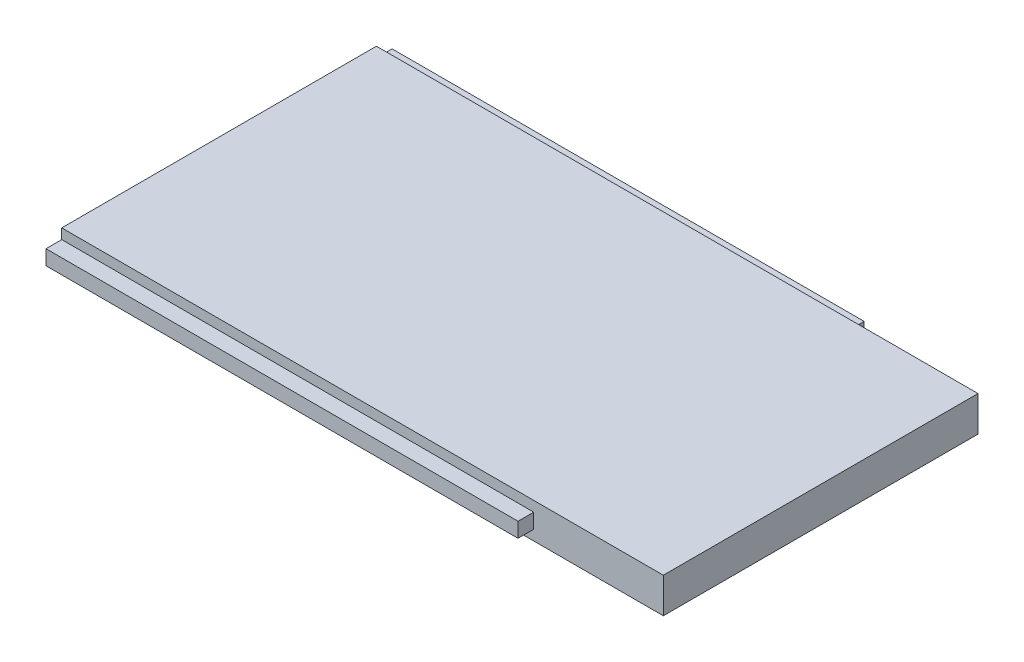
ISO-10303-21;
HEADER;
FILE_DESCRIPTION(('STEP AP214'),'2;1');
FILE_NAME('part.step','',(''),(''),'','','');
FILE_SCHEMA(('AUTOMOTIVE_DESIGN { 1 0 10303 214 1 1 1 1 }'));
ENDSEC;
DATA;
#1=APPLICATION_CONTEXT('core data for automotive mechanical design processes');
#2=APPLICATION_PROTOCOL_DEFINITION('international standard','automotive_design',2000,#1);
#3=PRODUCT_CONTEXT('',#1,'mechanical');
#4=PRODUCT('Part','Part','',(#3));
#5=PRODUCT_RELATED_PRODUCT_CATEGORY('part','',(#4));
#6=PRODUCT_DEFINITION_FORMATION('','',#4);
#7=PRODUCT_DEFINITION_CONTEXT('part definition',#1,'design');
#8=PRODUCT_DEFINITION('design','',#6,#7);
#9=PRODUCT_DEFINITION_SHAPE('','',#8);
#10=(LENGTH_UNIT() NAMED_UNIT(*) SI_UNIT(.MILLI.,.METRE.));
#11=(NAMED_UNIT(*) PLANE_ANGLE_UNIT() SI_UNIT($,.RADIAN.));
#12=(NAMED_UNIT(*) SI_UNIT($,.STERADIAN.) SOLID_ANGLE_UNIT());
#13=UNCERTAINTY_MEASURE_WITH_UNIT(LENGTH_MEASURE(1.E-05),#10,'distance_accuracy_value','');
#14=(GEOMETRIC_REPRESENTATION_CONTEXT(3) GLOBAL_UNCERTAINTY_ASSIGNED_CONTEXT((#13)) GLOBAL_UNIT_ASSIGNED_CONTEXT((#10,
#11,#12)) REPRESENTATION_CONTEXT('',''));
#15=CARTESIAN_POINT('',(0.,0.,0.));
#16=DIRECTION('',(0.,0.,1.));
#17=DIRECTION('',(1.,0.,0.));
#18=AXIS2_PLACEMENT_3D('',#15,#16,#17);
#19=CARTESIAN_POINT('',(0.,3.8,-34.));
#20=DIRECTION('',(0.,0.,-1.));
#21=DIRECTION('',(-1.,0.,0.));
#22=AXIS2_PLACEMENT_3D('',#19,#20,#21);
#23=PLANE('',#22);
#24=DIRECTION('',(1.,0.,0.));
#25=VECTOR('',#24,1.);
#26=CARTESIAN_POINT('',(51.,2.7,-34.));
#27=LINE('',#26,#25);
#28=CARTESIAN_POINT('',(0.,2.7,-34.));
#29=VERTEX_POINT('',#28);
#30=CARTESIAN_POINT('',(51.,2.7,-34.));
#31=VERTEX_POINT('',#30);
#32=EDGE_CURVE('E164',#29,#31,#27,.T.);
#33=ORIENTED_EDGE('',*,*,#32,.F.);
#34=DIRECTION('',(0.,-1.,0.));
#35=VECTOR('',#34,1.);
#36=CARTESIAN_POINT('',(0.,3.8,-34.));
#37=LINE('',#36,#35);
#38=CARTESIAN_POINT('',(0.,3.8,-34.));
#39=VERTEX_POINT('',#38);
#40=EDGE_CURVE('E11',#39,#29,#37,.T.);
#41=ORIENTED_EDGE('',*,*,#40,.F.);
#42=DIRECTION('',(1.,0.,0.));
#43=VECTOR('',#42,1.);
#44=CARTESIAN_POINT('',(0.,3.8,-34.));
#45=LINE('',#44,#43);
#46=CARTESIAN_POINT('',(65.,3.8,-34.));
#47=VERTEX_POINT('',#46);
#48=EDGE_CURVE('E188',#39,#47,#45,.T.);
#49=ORIENTED_EDGE('',*,*,#48,.T.);
#50=DIRECTION('',(0.,-1.,0.));
#51=VECTOR('',#50,1.);
#52=CARTESIAN_POINT('',(65.,3.8,-34.));
#53=LINE('',#52,#51);
#54=CARTESIAN_POINT('',(65.,0.,-34.));
#55=VERTEX_POINT('',#54);
#56=EDGE_CURVE('E38',#47,#55,#53,.T.);
#57=ORIENTED_EDGE('',*,*,#56,.T.);
#58=DIRECTION('',(1.,0.,0.));
#59=VECTOR('',#58,1.);
#60=CARTESIAN_POINT('',(0.,0.,-34.));
#61=LINE('',#60,#59);
#62=CARTESIAN_POINT('',(0.,0.,-34.));
#63=VERTEX_POINT('',#62);
#64=EDGE_CURVE('E187',#63,#55,#61,.T.);
#65=ORIENTED_EDGE('',*,*,#64,.F.);
#66=CARTESIAN_POINT('',(0.,1.1,-34.));
#67=VERTEX_POINT('',#66);
#68=EDGE_CURVE('E43',#67,#63,#37,.T.);
#69=ORIENTED_EDGE('',*,*,#68,.F.);
#70=DIRECTION('',(-1.,0.,0.));
#71=VECTOR('',#70,1.);
#72=CARTESIAN_POINT('',(51.,1.1,-34.));
#73=LINE('',#72,#71);
#74=CARTESIAN_POINT('',(51.,1.1,-34.));
#75=VERTEX_POINT('',#74);
#76=EDGE_CURVE('E172',#75,#67,#73,.T.);
#77=ORIENTED_EDGE('',*,*,#76,.F.);
#78=DIRECTION('',(0.,-1.,0.));
#79=VECTOR('',#78,1.);
#80=CARTESIAN_POINT('',(51.,2.7,-34.));
#81=LINE('',#80,#79);
#82=EDGE_CURVE('E59',#31,#75,#81,.T.);
#83=ORIENTED_EDGE('',*,*,#82,.F.);
#84=EDGE_LOOP('',(#33,#41,#49,#57,#65,#69,#77,#83));
#85=FACE_BOUND('',#84,.T.);
#86=ADVANCED_FACE('F35',(#85),#23,.T.);
#87=CARTESIAN_POINT('',(0.,3.8,0.));
#88=DIRECTION('',(-1.,0.,0.));
#89=DIRECTION('',(0.,0.,1.));
#90=AXIS2_PLACEMENT_3D('',#87,#88,#89);
#91=PLANE('',#90);
#92=DIRECTION('',(0.,0.,-1.));
#93=VECTOR('',#92,1.);
#94=CARTESIAN_POINT('',(0.,0.,0.));
#95=LINE('',#94,#93);
#96=CARTESIAN_POINT('',(0.,0.,0.));
#97=VERTEX_POINT('',#96);
#98=EDGE_CURVE('E192',#97,#63,#95,.T.);
#99=ORIENTED_EDGE('',*,*,#98,.F.);
#100=DIRECTION('',(0.,-1.,0.));
#101=VECTOR('',#100,1.);
#102=CARTESIAN_POINT('',(0.,3.8,0.));
#103=LINE('',#102,#101);
#104=CARTESIAN_POINT('',(0.,1.1,0.));
#105=VERTEX_POINT('',#104);
#106=EDGE_CURVE('E210',#105,#97,#103,.T.);
#107=ORIENTED_EDGE('',*,*,#106,.F.);
#108=DIRECTION('',(0.,0.,-1.));
#109=VECTOR('',#108,1.);
#110=CARTESIAN_POINT('',(0.,1.1,1.7));
#111=LINE('',#110,#109);
#112=CARTESIAN_POINT('',(0.,1.1,1.7));
#113=VERTEX_POINT('',#112);
#114=EDGE_CURVE('E157',#113,#105,#111,.T.);
#115=ORIENTED_EDGE('',*,*,#114,.F.);
#116=DIRECTION('',(0.,1.,0.));
#117=VECTOR('',#116,1.);
#118=CARTESIAN_POINT('',(0.,2.7,1.7));
#119=LINE('',#118,#117);
#120=CARTESIAN_POINT('',(0.,2.7,1.7));
#121=VERTEX_POINT('',#120);
#122=EDGE_CURVE('E145',#113,#121,#119,.T.);
#123=ORIENTED_EDGE('',*,*,#122,.T.);
#124=DIRECTION('',(0.,0.,-1.));
#125=VECTOR('',#124,1.);
#126=CARTESIAN_POINT('',(0.,2.7,1.7));
#127=LINE('',#126,#125);
#128=CARTESIAN_POINT('',(0.,2.7,0.));
#129=VERTEX_POINT('',#128);
#130=EDGE_CURVE('E132',#121,#129,#127,.T.);
#131=ORIENTED_EDGE('',*,*,#130,.T.);
#132=CARTESIAN_POINT('',(0.,3.8,0.));
#133=VERTEX_POINT('',#132);
#134=EDGE_CURVE('E208',#133,#129,#103,.T.);
#135=ORIENTED_EDGE('',*,*,#134,.F.);
#136=DIRECTION('',(0.,0.,-1.));
#137=VECTOR('',#136,1.);
#138=CARTESIAN_POINT('',(0.,3.8,0.));
#139=LINE('',#138,#137);
#140=EDGE_CURVE('E196',#133,#39,#139,.T.);
#141=ORIENTED_EDGE('',*,*,#140,.T.);
#142=ORIENTED_EDGE('',*,*,#40,.T.);
#143=DIRECTION('',(0.,0.,1.));
#144=VECTOR('',#143,1.);
#145=CARTESIAN_POINT('',(0.,2.7,-35.7));
#146=LINE('',#145,#144);
#147=CARTESIAN_POINT('',(0.,2.7,-35.7));
#148=VERTEX_POINT('',#147);
#149=EDGE_CURVE('E178',#148,#29,#146,.T.);
#150=ORIENTED_EDGE('',*,*,#149,.F.);
#151=DIRECTION('',(0.,1.,0.));
#152=VECTOR('',#151,1.);
#153=CARTESIAN_POINT('',(0.,2.7,-35.7));
#154=LINE('',#153,#152);
#155=CARTESIAN_POINT('',(0.,1.1,-35.7));
#156=VERTEX_POINT('',#155);
#157=EDGE_CURVE('E166',#156,#148,#154,.T.);
#158=ORIENTED_EDGE('',*,*,#157,.F.);
#159=DIRECTION('',(0.,0.,1.));
#160=VECTOR('',#159,1.);
#161=CARTESIAN_POINT('',(0.,1.1,-35.7));
#162=LINE('',#161,#160);
#163=EDGE_CURVE('E181',#156,#67,#162,.T.);
#164=ORIENTED_EDGE('',*,*,#163,.T.);
#165=ORIENTED_EDGE('',*,*,#68,.T.);
#166=EDGE_LOOP('',(#99,#107,#115,#123,#131,#135,#141,#142,#150,#158,#164,#165));
#167=FACE_BOUND('',#166,.T.);
#168=ADVANCED_FACE('F227',(#167),#91,.T.);
#169=CARTESIAN_POINT('',(0.,3.8,0.));
#170=DIRECTION('',(0.,0.,-1.));
#171=DIRECTION('',(-1.,0.,0.));
#172=AXIS2_PLACEMENT_3D('',#169,#170,#171);
#173=PLANE('',#172);
#174=DIRECTION('',(0.,-1.,0.));
#175=VECTOR('',#174,1.);
#176=CARTESIAN_POINT('',(51.,2.7,0.));
#177=LINE('',#176,#175);
#178=CARTESIAN_POINT('',(51.,2.7,0.));
#179=VERTEX_POINT('',#178);
#180=CARTESIAN_POINT('',(51.,1.1,0.));
#181=VERTEX_POINT('',#180);
#182=EDGE_CURVE('E51',#179,#181,#177,.T.);
#183=ORIENTED_EDGE('',*,*,#182,.T.);
#184=DIRECTION('',(-1.,0.,0.));
#185=VECTOR('',#184,1.);
#186=CARTESIAN_POINT('',(51.,1.1,0.));
#187=LINE('',#186,#185);
#188=EDGE_CURVE('E142',#181,#105,#187,.T.);
#189=ORIENTED_EDGE('',*,*,#188,.T.);
#190=ORIENTED_EDGE('',*,*,#106,.T.);
#191=DIRECTION('',(1.,0.,0.));
#192=VECTOR('',#191,1.);
#193=CARTESIAN_POINT('',(0.,0.,0.));
#194=LINE('',#193,#192);
#195=CARTESIAN_POINT('',(65.,0.,0.));
#196=VERTEX_POINT('',#195);
#197=EDGE_CURVE('E204',#97,#196,#194,.T.);
#198=ORIENTED_EDGE('',*,*,#197,.T.);
#199=DIRECTION('',(0.,-1.,0.));
#200=VECTOR('',#199,1.);
#201=CARTESIAN_POINT('',(65.,3.8,0.));
#202=LINE('',#201,#200);
#203=CARTESIAN_POINT('',(65.,3.8,0.));
#204=VERTEX_POINT('',#203);
#205=EDGE_CURVE('E211',#204,#196,#202,.T.);
#206=ORIENTED_EDGE('',*,*,#205,.F.);
#207=DIRECTION('',(1.,0.,0.));
#208=VECTOR('',#207,1.);
#209=CARTESIAN_POINT('',(0.,3.8,0.));
#210=LINE('',#209,#208);
#211=EDGE_CURVE('E194',#133,#204,#210,.T.);
#212=ORIENTED_EDGE('',*,*,#211,.F.);
#213=ORIENTED_EDGE('',*,*,#134,.T.);
#214=DIRECTION('',(1.,0.,0.));
#215=VECTOR('',#214,1.);
#216=CARTESIAN_POINT('',(51.,2.7,0.));
#217=LINE('',#216,#215);
#218=EDGE_CURVE('E152',#129,#179,#217,.T.);
#219=ORIENTED_EDGE('',*,*,#218,.T.);
#220=EDGE_LOOP('',(#183,#189,#190,#198,#206,#212,#213,#219));
#221=FACE_BOUND('',#220,.T.);
#222=ADVANCED_FACE('F246',(#221),#173,.F.);
#223=CARTESIAN_POINT('',(65.,3.8,0.));
#224=DIRECTION('',(-1.,0.,0.));
#225=DIRECTION('',(0.,0.,1.));
#226=AXIS2_PLACEMENT_3D('',#223,#224,#225);
#227=PLANE('',#226);
#228=DIRECTION('',(0.,0.,-1.));
#229=VECTOR('',#228,1.);
#230=CARTESIAN_POINT('',(65.,0.,0.));
#231=LINE('',#230,#229);
#232=EDGE_CURVE('E201',#196,#55,#231,.T.);
#233=ORIENTED_EDGE('',*,*,#232,.T.);
#234=ORIENTED_EDGE('',*,*,#56,.F.);
#235=DIRECTION('',(0.,0.,-1.));
#236=VECTOR('',#235,1.);
#237=CARTESIAN_POINT('',(65.,3.8,0.));
#238=LINE('',#237,#236);
#239=EDGE_CURVE('E191',#204,#47,#238,.T.);
#240=ORIENTED_EDGE('',*,*,#239,.F.);
#241=ORIENTED_EDGE('',*,*,#205,.T.);
#242=EDGE_LOOP('',(#233,#234,#240,#241));
#243=FACE_BOUND('',#242,.T.);
#244=ADVANCED_FACE('F220',(#243),#227,.F.);
#245=CARTESIAN_POINT('',(0.,3.8,0.));
#246=DIRECTION('',(0.,1.,0.));
#247=DIRECTION('',(0.,0.,1.));
#248=AXIS2_PLACEMENT_3D('',#245,#246,#247);
#249=PLANE('',#248);
#250=ORIENTED_EDGE('',*,*,#48,.F.);
#251=ORIENTED_EDGE('',*,*,#140,.F.);
#252=ORIENTED_EDGE('',*,*,#211,.T.);
#253=ORIENTED_EDGE('',*,*,#239,.T.);
#254=EDGE_LOOP('',(#250,#251,#252,#253));
#255=FACE_BOUND('',#254,.T.);
#256=ADVANCED_FACE('F244',(#255),#249,.T.);
#257=CARTESIAN_POINT('',(0.,0.,0.));
#258=DIRECTION('',(0.,1.,0.));
#259=DIRECTION('',(0.,0.,1.));
#260=AXIS2_PLACEMENT_3D('',#257,#258,#259);
#261=PLANE('',#260);
#262=ORIENTED_EDGE('',*,*,#64,.T.);
#263=ORIENTED_EDGE('',*,*,#232,.F.);
#264=ORIENTED_EDGE('',*,*,#197,.F.);
#265=ORIENTED_EDGE('',*,*,#98,.T.);
#266=EDGE_LOOP('',(#262,#263,#264,#265));
#267=FACE_BOUND('',#266,.T.);
#268=ADVANCED_FACE('F223',(#267),#261,.F.);
#269=CARTESIAN_POINT('',(51.,2.7,-35.7));
#270=DIRECTION('',(-1.,0.,0.));
#271=DIRECTION('',(0.,0.,1.));
#272=AXIS2_PLACEMENT_3D('',#269,#270,#271);
#273=PLANE('',#272);
#274=ORIENTED_EDGE('',*,*,#82,.T.);
#275=DIRECTION('',(0.,0.,1.));
#276=VECTOR('',#275,1.);
#277=CARTESIAN_POINT('',(51.,1.1,-35.7));
#278=LINE('',#277,#276);
#279=CARTESIAN_POINT('',(51.,1.1,-35.7));
#280=VERTEX_POINT('',#279);
#281=EDGE_CURVE('E184',#280,#75,#278,.T.);
#282=ORIENTED_EDGE('',*,*,#281,.F.);
#283=DIRECTION('',(0.,-1.,0.));
#284=VECTOR('',#283,1.);
#285=CARTESIAN_POINT('',(51.,2.7,-35.7));
#286=LINE('',#285,#284);
#287=CARTESIAN_POINT('',(51.,2.7,-35.7));
#288=VERTEX_POINT('',#287);
#289=EDGE_CURVE('E160',#288,#280,#286,.T.);
#290=ORIENTED_EDGE('',*,*,#289,.F.);
#291=DIRECTION('',(0.,0.,1.));
#292=VECTOR('',#291,1.);
#293=CARTESIAN_POINT('',(51.,2.7,-35.7));
#294=LINE('',#293,#292);
#295=EDGE_CURVE('E170',#288,#31,#294,.T.);
#296=ORIENTED_EDGE('',*,*,#295,.T.);
#297=EDGE_LOOP('',(#274,#282,#290,#296));
#298=FACE_BOUND('',#297,.T.);
#299=ADVANCED_FACE('F235',(#298),#273,.F.);
#300=CARTESIAN_POINT('',(51.,1.1,-35.7));
#301=DIRECTION('',(0.,1.,0.));
#302=DIRECTION('',(0.,0.,1.));
#303=AXIS2_PLACEMENT_3D('',#300,#301,#302);
#304=PLANE('',#303);
#305=ORIENTED_EDGE('',*,*,#76,.T.);
#306=ORIENTED_EDGE('',*,*,#163,.F.);
#307=DIRECTION('',(-1.,0.,0.));
#308=VECTOR('',#307,1.);
#309=CARTESIAN_POINT('',(51.,1.1,-35.7));
#310=LINE('',#309,#308);
#311=EDGE_CURVE('E163',#280,#156,#310,.T.);
#312=ORIENTED_EDGE('',*,*,#311,.F.);
#313=ORIENTED_EDGE('',*,*,#281,.T.);
#314=EDGE_LOOP('',(#305,#306,#312,#313));
#315=FACE_BOUND('',#314,.T.);
#316=ADVANCED_FACE('F231',(#315),#304,.F.);
#317=CARTESIAN_POINT('',(51.,2.7,-35.7));
#318=DIRECTION('',(0.,-1.,0.));
#319=DIRECTION('',(0.,0.,-1.));
#320=AXIS2_PLACEMENT_3D('',#317,#318,#319);
#321=PLANE('',#320);
#322=ORIENTED_EDGE('',*,*,#32,.T.);
#323=ORIENTED_EDGE('',*,*,#295,.F.);
#324=DIRECTION('',(1.,0.,0.));
#325=VECTOR('',#324,1.);
#326=CARTESIAN_POINT('',(51.,2.7,-35.7));
#327=LINE('',#326,#325);
#328=EDGE_CURVE('E168',#148,#288,#327,.T.);
#329=ORIENTED_EDGE('',*,*,#328,.F.);
#330=ORIENTED_EDGE('',*,*,#149,.T.);
#331=EDGE_LOOP('',(#322,#323,#329,#330));
#332=FACE_BOUND('',#331,.T.);
#333=ADVANCED_FACE('F239',(#332),#321,.F.);
#334=CARTESIAN_POINT('',(0.,0.,-35.7));
#335=DIRECTION('',(0.,0.,-1.));
#336=DIRECTION('',(-1.,0.,0.));
#337=AXIS2_PLACEMENT_3D('',#334,#335,#336);
#338=PLANE('',#337);
#339=ORIENTED_EDGE('',*,*,#289,.T.);
#340=ORIENTED_EDGE('',*,*,#311,.T.);
#341=ORIENTED_EDGE('',*,*,#157,.T.);
#342=ORIENTED_EDGE('',*,*,#328,.T.);
#343=EDGE_LOOP('',(#339,#340,#341,#342));
#344=FACE_BOUND('',#343,.T.);
#345=ADVANCED_FACE('F283',(#344),#338,.T.);
#346=CARTESIAN_POINT('',(51.,2.7,1.7));
#347=DIRECTION('',(1.,0.,0.));
#348=DIRECTION('',(0.,0.,-1.));
#349=AXIS2_PLACEMENT_3D('',#346,#347,#348);
#350=PLANE('',#349);
#351=ORIENTED_EDGE('',*,*,#182,.F.);
#352=DIRECTION('',(0.,0.,-1.));
#353=VECTOR('',#352,1.);
#354=CARTESIAN_POINT('',(51.,2.7,1.7));
#355=LINE('',#354,#353);
#356=CARTESIAN_POINT('',(51.,2.7,1.7));
#357=VERTEX_POINT('',#356);
#358=EDGE_CURVE('E123',#357,#179,#355,.T.);
#359=ORIENTED_EDGE('',*,*,#358,.F.);
#360=DIRECTION('',(0.,-1.,0.));
#361=VECTOR('',#360,1.);
#362=CARTESIAN_POINT('',(51.,2.7,1.7));
#363=LINE('',#362,#361);
#364=CARTESIAN_POINT('',(51.,1.1,1.7));
#365=VERTEX_POINT('',#364);
#366=EDGE_CURVE('E126',#357,#365,#363,.T.);
#367=ORIENTED_EDGE('',*,*,#366,.T.);
#368=DIRECTION('',(0.,0.,-1.));
#369=VECTOR('',#368,1.);
#370=CARTESIAN_POINT('',(51.,1.1,1.7));
#371=LINE('',#370,#369);
#372=EDGE_CURVE('E150',#365,#181,#371,.T.);
#373=ORIENTED_EDGE('',*,*,#372,.T.);
#374=EDGE_LOOP('',(#351,#359,#367,#373));
#375=FACE_BOUND('',#374,.T.);
#376=ADVANCED_FACE('F125',(#375),#350,.T.);
#377=CARTESIAN_POINT('',(51.,2.7,1.7));
#378=DIRECTION('',(0.,1.,0.));
#379=DIRECTION('',(0.,0.,1.));
#380=AXIS2_PLACEMENT_3D('',#377,#378,#379);
#381=PLANE('',#380);
#382=ORIENTED_EDGE('',*,*,#218,.F.);
#383=ORIENTED_EDGE('',*,*,#130,.F.);
#384=DIRECTION('',(1.,0.,0.));
#385=VECTOR('',#384,1.);
#386=CARTESIAN_POINT('',(51.,2.7,1.7));
#387=LINE('',#386,#385);
#388=EDGE_CURVE('E138',#121,#357,#387,.T.);
#389=ORIENTED_EDGE('',*,*,#388,.T.);
#390=ORIENTED_EDGE('',*,*,#358,.T.);
#391=EDGE_LOOP('',(#382,#383,#389,#390));
#392=FACE_BOUND('',#391,.T.);
#393=ADVANCED_FACE('F144',(#392),#381,.T.);
#394=CARTESIAN_POINT('',(51.,1.1,1.7));
#395=DIRECTION('',(0.,-1.,0.));
#396=DIRECTION('',(0.,0.,-1.));
#397=AXIS2_PLACEMENT_3D('',#394,#395,#396);
#398=PLANE('',#397);
#399=ORIENTED_EDGE('',*,*,#188,.F.);
#400=ORIENTED_EDGE('',*,*,#372,.F.);
#401=DIRECTION('',(-1.,0.,0.));
#402=VECTOR('',#401,1.);
#403=CARTESIAN_POINT('',(51.,1.1,1.7));
#404=LINE('',#403,#402);
#405=EDGE_CURVE('E141',#365,#113,#404,.T.);
#406=ORIENTED_EDGE('',*,*,#405,.T.);
#407=ORIENTED_EDGE('',*,*,#114,.T.);
#408=EDGE_LOOP('',(#399,#400,#406,#407));
#409=FACE_BOUND('',#408,.T.);
#410=ADVANCED_FACE('F249',(#409),#398,.T.);
#411=CARTESIAN_POINT('',(0.,0.,1.7));
#412=DIRECTION('',(0.,0.,1.));
#413=DIRECTION('',(-1.,0.,0.));
#414=AXIS2_PLACEMENT_3D('',#411,#412,#413);
#415=PLANE('',#414);
#416=ORIENTED_EDGE('',*,*,#366,.F.);
#417=ORIENTED_EDGE('',*,*,#388,.F.);
#418=ORIENTED_EDGE('',*,*,#122,.F.);
#419=ORIENTED_EDGE('',*,*,#405,.F.);
#420=EDGE_LOOP('',(#416,#417,#418,#419));
#421=FACE_BOUND('',#420,.T.);
#422=ADVANCED_FACE('F136',(#421),#415,.T.);
#423=CLOSED_SHELL('',(#86,#168,#222,#244,#256,#268,#299,#316,#333,#345,#376,#393,#410,#422));
#424=MANIFOLD_SOLID_BREP('B2',#423);
#425=ADVANCED_BREP_SHAPE_REPRESENTATION('',(#18,#424),#14);
#426=SHAPE_DEFINITION_REPRESENTATION(#9,#425);
ENDSEC;
END-ISO-10303-21;
